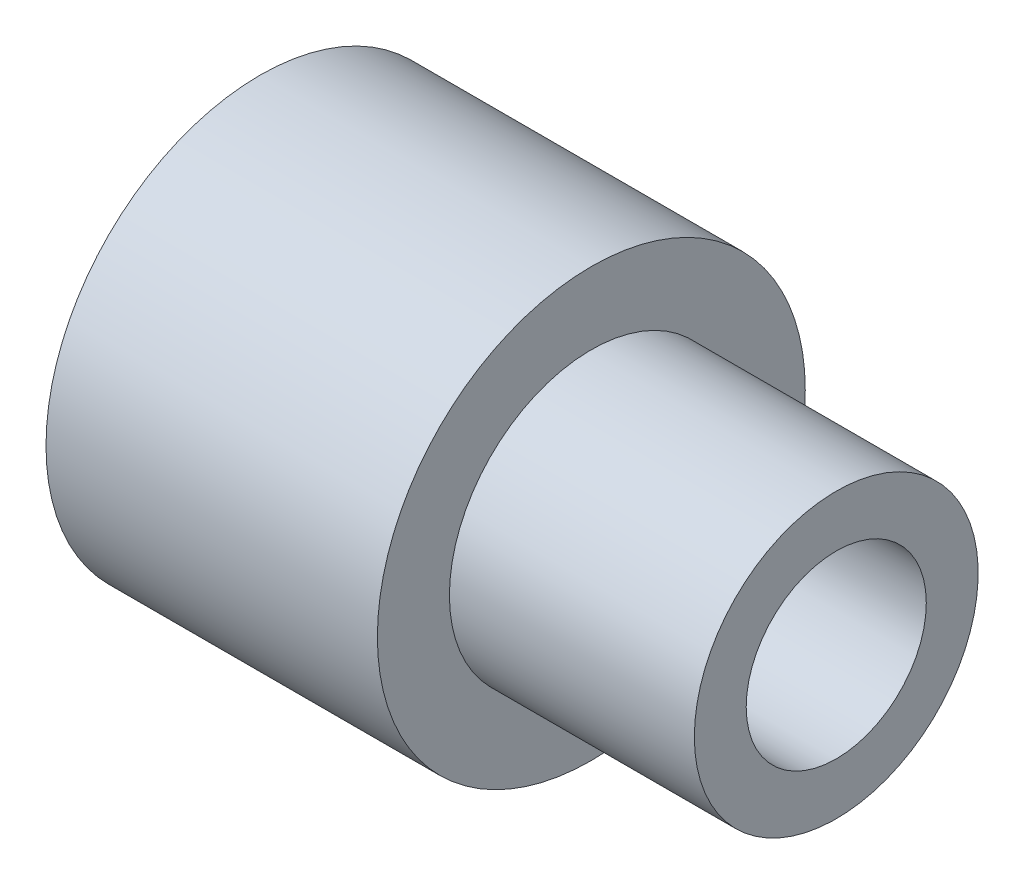
ISO-10303-21;
HEADER;
FILE_DESCRIPTION(('STEP AP214'),'2;1');
FILE_NAME('part.step','',(''),(''),'','','');
FILE_SCHEMA(('AUTOMOTIVE_DESIGN { 1 0 10303 214 1 1 1 1 }'));
ENDSEC;
DATA;
#1=APPLICATION_CONTEXT('core data for automotive mechanical design processes');
#2=APPLICATION_PROTOCOL_DEFINITION('international standard','automotive_design',2000,#1);
#3=PRODUCT_CONTEXT('',#1,'mechanical');
#4=PRODUCT('Part','Part','',(#3));
#5=PRODUCT_RELATED_PRODUCT_CATEGORY('part','',(#4));
#6=PRODUCT_DEFINITION_FORMATION('','',#4);
#7=PRODUCT_DEFINITION_CONTEXT('part definition',#1,'design');
#8=PRODUCT_DEFINITION('design','',#6,#7);
#9=PRODUCT_DEFINITION_SHAPE('','',#8);
#10=(LENGTH_UNIT() NAMED_UNIT(*) SI_UNIT(.MILLI.,.METRE.));
#11=(NAMED_UNIT(*) PLANE_ANGLE_UNIT() SI_UNIT($,.RADIAN.));
#12=(NAMED_UNIT(*) SI_UNIT($,.STERADIAN.) SOLID_ANGLE_UNIT());
#13=UNCERTAINTY_MEASURE_WITH_UNIT(LENGTH_MEASURE(1.E-05),#10,'distance_accuracy_value','');
#14=(GEOMETRIC_REPRESENTATION_CONTEXT(3) GLOBAL_UNCERTAINTY_ASSIGNED_CONTEXT((#13)) GLOBAL_UNIT_ASSIGNED_CONTEXT((#10,
#11,#12)) REPRESENTATION_CONTEXT('',''));
#15=CARTESIAN_POINT('',(0.,0.,0.));
#16=DIRECTION('',(0.,0.,1.));
#17=DIRECTION('',(1.,0.,0.));
#18=AXIS2_PLACEMENT_3D('',#15,#16,#17);
#19=CARTESIAN_POINT('',(5.842,0.,0.));
#20=DIRECTION('',(1.,0.,0.));
#21=DIRECTION('',(0.,0.,1.));
#22=AXIS2_PLACEMENT_3D('',#19,#20,#21);
#23=PLANE('',#22);
#24=CARTESIAN_POINT('',(5.842,0.,0.));
#25=DIRECTION('',(-1.,0.,0.));
#26=DIRECTION('',(0.,0.,1.));
#27=AXIS2_PLACEMENT_3D('',#24,#25,#26);
#28=CIRCLE('',#27,3.7719);
#29=CARTESIAN_POINT('',(5.842,0.,3.7719));
#30=VERTEX_POINT('',#29);
#31=EDGE_CURVE('E10',#30,#30,#28,.T.);
#32=ORIENTED_EDGE('',*,*,#31,.F.);
#33=EDGE_LOOP('',(#32));
#34=FACE_BOUND('',#33,.T.);
#35=CARTESIAN_POINT('',(5.842,0.,0.));
#36=DIRECTION('',(-1.,0.,0.));
#37=DIRECTION('',(0.,0.,1.));
#38=AXIS2_PLACEMENT_3D('',#35,#36,#37);
#39=CIRCLE('',#38,2.5019);
#40=CARTESIAN_POINT('',(5.842,0.,2.5019));
#41=VERTEX_POINT('',#40);
#42=EDGE_CURVE('E48',#41,#41,#39,.T.);
#43=ORIENTED_EDGE('',*,*,#42,.T.);
#44=EDGE_LOOP('',(#43));
#45=FACE_BOUND('',#44,.T.);
#46=ADVANCED_FACE('F35',(#34,#45),#23,.T.);
#47=CARTESIAN_POINT('',(5.842,0.,0.));
#48=DIRECTION('',(-1.,0.,0.));
#49=DIRECTION('',(0.,0.,-1.));
#50=AXIS2_PLACEMENT_3D('',#47,#48,#49);
#51=CYLINDRICAL_SURFACE('',#50,3.7719);
#52=ORIENTED_EDGE('',*,*,#31,.T.);
#53=EDGE_LOOP('',(#52));
#54=FACE_BOUND('',#53,.T.);
#55=CARTESIAN_POINT('',(0.,0.,0.));
#56=DIRECTION('',(-1.,0.,0.));
#57=DIRECTION('',(0.,0.,1.));
#58=AXIS2_PLACEMENT_3D('',#55,#56,#57);
#59=CIRCLE('',#58,3.7719);
#60=CARTESIAN_POINT('',(0.,0.,3.7719));
#61=VERTEX_POINT('',#60);
#62=EDGE_CURVE('E39',#61,#61,#59,.T.);
#63=ORIENTED_EDGE('',*,*,#62,.F.);
#64=EDGE_LOOP('',(#63));
#65=FACE_BOUND('',#64,.T.);
#66=ADVANCED_FACE('F37',(#54,#65),#51,.T.);
#67=CARTESIAN_POINT('',(0.,0.,0.));
#68=DIRECTION('',(1.,0.,0.));
#69=DIRECTION('',(0.,0.,1.));
#70=AXIS2_PLACEMENT_3D('',#67,#68,#69);
#71=PLANE('',#70);
#72=CARTESIAN_POINT('',(0.,0.,0.));
#73=DIRECTION('',(-1.,0.,0.));
#74=DIRECTION('',(0.,0.,1.));
#75=AXIS2_PLACEMENT_3D('',#72,#73,#74);
#76=CIRCLE('',#75,1.5875);
#77=CARTESIAN_POINT('',(0.,0.,1.5875));
#78=VERTEX_POINT('',#77);
#79=EDGE_CURVE('E51',#78,#78,#76,.T.);
#80=ORIENTED_EDGE('',*,*,#79,.F.);
#81=EDGE_LOOP('',(#80));
#82=FACE_BOUND('',#81,.T.);
#83=ORIENTED_EDGE('',*,*,#62,.T.);
#84=EDGE_LOOP('',(#83));
#85=FACE_BOUND('',#84,.T.);
#86=ADVANCED_FACE('F63',(#82,#85),#71,.F.);
#87=CARTESIAN_POINT('',(10.16,0.,0.));
#88=DIRECTION('',(-1.,0.,0.));
#89=DIRECTION('',(0.,0.,-1.));
#90=AXIS2_PLACEMENT_3D('',#87,#88,#89);
#91=CYLINDRICAL_SURFACE('',#90,2.5019);
#92=CARTESIAN_POINT('',(10.16,0.,0.));
#93=DIRECTION('',(-1.,0.,0.));
#94=DIRECTION('',(0.,0.,1.));
#95=AXIS2_PLACEMENT_3D('',#92,#93,#94);
#96=CIRCLE('',#95,2.5019);
#97=CARTESIAN_POINT('',(10.16,0.,2.5019));
#98=VERTEX_POINT('',#97);
#99=EDGE_CURVE('E46',#98,#98,#96,.T.);
#100=ORIENTED_EDGE('',*,*,#99,.T.);
#101=EDGE_LOOP('',(#100));
#102=FACE_BOUND('',#101,.T.);
#103=ORIENTED_EDGE('',*,*,#42,.F.);
#104=EDGE_LOOP('',(#103));
#105=FACE_BOUND('',#104,.T.);
#106=ADVANCED_FACE('F66',(#102,#105),#91,.T.);
#107=CARTESIAN_POINT('',(10.16,0.,0.));
#108=DIRECTION('',(1.,0.,0.));
#109=DIRECTION('',(0.,0.,1.));
#110=AXIS2_PLACEMENT_3D('',#107,#108,#109);
#111=PLANE('',#110);
#112=CARTESIAN_POINT('',(10.16,0.,0.));
#113=DIRECTION('',(-1.,0.,0.));
#114=DIRECTION('',(0.,0.,1.));
#115=AXIS2_PLACEMENT_3D('',#112,#113,#114);
#116=CIRCLE('',#115,1.5875);
#117=CARTESIAN_POINT('',(10.16,0.,1.5875));
#118=VERTEX_POINT('',#117);
#119=EDGE_CURVE('E54',#118,#118,#116,.T.);
#120=ORIENTED_EDGE('',*,*,#119,.T.);
#121=EDGE_LOOP('',(#120));
#122=FACE_BOUND('',#121,.T.);
#123=ORIENTED_EDGE('',*,*,#99,.F.);
#124=EDGE_LOOP('',(#123));
#125=FACE_BOUND('',#124,.T.);
#126=ADVANCED_FACE('F81',(#122,#125),#111,.T.);
#127=CARTESIAN_POINT('',(0.,0.,0.));
#128=DIRECTION('',(1.,0.,0.));
#129=DIRECTION('',(0.,0.,1.));
#130=AXIS2_PLACEMENT_3D('',#127,#128,#129);
#131=CYLINDRICAL_SURFACE('',#130,1.5875);
#132=ORIENTED_EDGE('',*,*,#79,.T.);
#133=EDGE_LOOP('',(#132));
#134=FACE_BOUND('',#133,.T.);
#135=ORIENTED_EDGE('',*,*,#119,.F.);
#136=EDGE_LOOP('',(#135));
#137=FACE_BOUND('',#136,.T.);
#138=ADVANCED_FACE('F60',(#134,#137),#131,.F.);
#139=CLOSED_SHELL('',(#46,#66,#86,#106,#126,#138));
#140=MANIFOLD_SOLID_BREP('B2',#139);
#141=ADVANCED_BREP_SHAPE_REPRESENTATION('',(#18,#140),#14);
#142=SHAPE_DEFINITION_REPRESENTATION(#9,#141);
ENDSEC;
END-ISO-10303-21;
